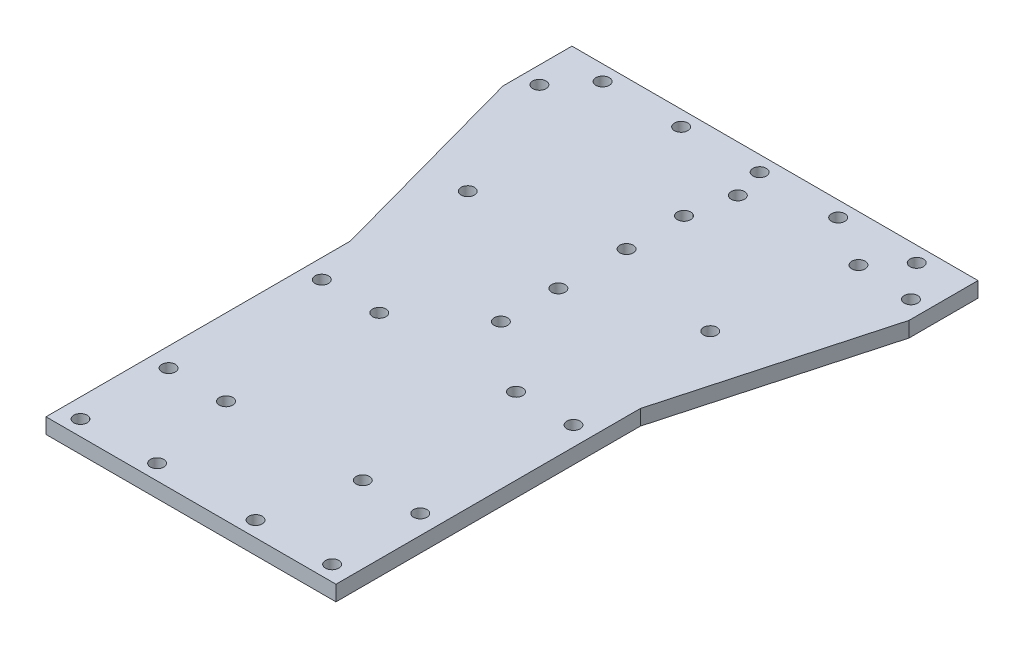
ISO-10303-21;
HEADER;
FILE_DESCRIPTION(('STEP AP214'),'2;1');
FILE_NAME('part.step','',(''),(''),'','','');
FILE_SCHEMA(('AUTOMOTIVE_DESIGN { 1 0 10303 214 1 1 1 1 }'));
ENDSEC;
DATA;
#1=APPLICATION_CONTEXT('core data for automotive mechanical design processes');
#2=APPLICATION_PROTOCOL_DEFINITION('international standard','automotive_design',2000,#1);
#3=PRODUCT_CONTEXT('',#1,'mechanical');
#4=PRODUCT('Part','Part','',(#3));
#5=PRODUCT_RELATED_PRODUCT_CATEGORY('part','',(#4));
#6=PRODUCT_DEFINITION_FORMATION('','',#4);
#7=PRODUCT_DEFINITION_CONTEXT('part definition',#1,'design');
#8=PRODUCT_DEFINITION('design','',#6,#7);
#9=PRODUCT_DEFINITION_SHAPE('','',#8);
#10=(LENGTH_UNIT() NAMED_UNIT(*) SI_UNIT(.MILLI.,.METRE.));
#11=(NAMED_UNIT(*) PLANE_ANGLE_UNIT() SI_UNIT($,.RADIAN.));
#12=(NAMED_UNIT(*) SI_UNIT($,.STERADIAN.) SOLID_ANGLE_UNIT());
#13=UNCERTAINTY_MEASURE_WITH_UNIT(LENGTH_MEASURE(1.E-05),#10,'distance_accuracy_value','');
#14=(GEOMETRIC_REPRESENTATION_CONTEXT(3) GLOBAL_UNCERTAINTY_ASSIGNED_CONTEXT((#13)) GLOBAL_UNIT_ASSIGNED_CONTEXT((#10,
#11,#12)) REPRESENTATION_CONTEXT('',''));
#15=CARTESIAN_POINT('',(0.,0.,0.));
#16=DIRECTION('',(0.,0.,1.));
#17=DIRECTION('',(1.,0.,0.));
#18=AXIS2_PLACEMENT_3D('',#15,#16,#17);
#19=CARTESIAN_POINT('',(37.85,4.,-21.35));
#20=DIRECTION('',(-1.,0.,0.));
#21=DIRECTION('',(0.,0.,1.));
#22=AXIS2_PLACEMENT_3D('',#19,#20,#21);
#23=PLANE('',#22);
#24=DIRECTION('',(0.,0.,-1.));
#25=VECTOR('',#24,1.);
#26=CARTESIAN_POINT('',(37.85,0.,-21.35));
#27=LINE('',#26,#25);
#28=CARTESIAN_POINT('',(37.85,0.,123.1));
#29=VERTEX_POINT('',#28);
#30=CARTESIAN_POINT('',(37.85,0.,43.65));
#31=VERTEX_POINT('',#30);
#32=EDGE_CURVE('E126',#29,#31,#27,.T.);
#33=ORIENTED_EDGE('',*,*,#32,.T.);
#34=DIRECTION('',(0.,1.,0.));
#35=VECTOR('',#34,1.);
#36=CARTESIAN_POINT('',(37.85,0.,43.65));
#37=LINE('',#36,#35);
#38=CARTESIAN_POINT('',(37.85,4.,43.65));
#39=VERTEX_POINT('',#38);
#40=EDGE_CURVE('E110',#31,#39,#37,.T.);
#41=ORIENTED_EDGE('',*,*,#40,.T.);
#42=DIRECTION('',(0.,0.,-1.));
#43=VECTOR('',#42,1.);
#44=CARTESIAN_POINT('',(37.85,4.,-21.35));
#45=LINE('',#44,#43);
#46=CARTESIAN_POINT('',(37.85,4.,123.1));
#47=VERTEX_POINT('',#46);
#48=EDGE_CURVE('E55',#47,#39,#45,.T.);
#49=ORIENTED_EDGE('',*,*,#48,.F.);
#50=DIRECTION('',(0.,-1.,0.));
#51=VECTOR('',#50,1.);
#52=CARTESIAN_POINT('',(37.85,4.,123.1));
#53=LINE('',#52,#51);
#54=EDGE_CURVE('E361',#47,#29,#53,.T.);
#55=ORIENTED_EDGE('',*,*,#54,.T.);
#56=EDGE_LOOP('',(#33,#41,#49,#55));
#57=FACE_BOUND('',#56,.T.);
#58=ADVANCED_FACE('F45',(#57),#23,.F.);
#59=CARTESIAN_POINT('',(-37.85,4.,-21.35));
#60=DIRECTION('',(1.,0.,0.));
#61=DIRECTION('',(0.,0.,-1.));
#62=AXIS2_PLACEMENT_3D('',#59,#60,#61);
#63=PLANE('',#62);
#64=DIRECTION('',(0.,0.,1.));
#65=VECTOR('',#64,1.);
#66=CARTESIAN_POINT('',(-37.85,4.,-21.35));
#67=LINE('',#66,#65);
#68=CARTESIAN_POINT('',(-37.85,4.,43.65));
#69=VERTEX_POINT('',#68);
#70=CARTESIAN_POINT('',(-37.85,4.,123.1));
#71=VERTEX_POINT('',#70);
#72=EDGE_CURVE('E11',#69,#71,#67,.T.);
#73=ORIENTED_EDGE('',*,*,#72,.F.);
#74=DIRECTION('',(0.,1.,0.));
#75=VECTOR('',#74,1.);
#76=CARTESIAN_POINT('',(-37.85,0.,43.65));
#77=LINE('',#76,#75);
#78=CARTESIAN_POINT('',(-37.85,0.,43.65));
#79=VERTEX_POINT('',#78);
#80=EDGE_CURVE('E392',#79,#69,#77,.T.);
#81=ORIENTED_EDGE('',*,*,#80,.F.);
#82=DIRECTION('',(0.,0.,1.));
#83=VECTOR('',#82,1.);
#84=CARTESIAN_POINT('',(-37.85,0.,-21.35));
#85=LINE('',#84,#83);
#86=CARTESIAN_POINT('',(-37.85,0.,123.1));
#87=VERTEX_POINT('',#86);
#88=EDGE_CURVE('E48',#79,#87,#85,.T.);
#89=ORIENTED_EDGE('',*,*,#88,.T.);
#90=DIRECTION('',(0.,-1.,0.));
#91=VECTOR('',#90,1.);
#92=CARTESIAN_POINT('',(-37.85,4.,123.1));
#93=LINE('',#92,#91);
#94=EDGE_CURVE('E357',#71,#87,#93,.T.);
#95=ORIENTED_EDGE('',*,*,#94,.F.);
#96=EDGE_LOOP('',(#73,#81,#89,#95));
#97=FACE_BOUND('',#96,.T.);
#98=ADVANCED_FACE('F433',(#97),#63,.F.);
#99=CARTESIAN_POINT('',(0.,4.,0.));
#100=DIRECTION('',(0.,1.,0.));
#101=DIRECTION('',(0.,0.,1.));
#102=AXIS2_PLACEMENT_3D('',#99,#100,#101);
#103=PLANE('',#102);
#104=ORIENTED_EDGE('',*,*,#48,.T.);
#105=DIRECTION('',(0.265563872912816,0.,-0.964093268000324));
#106=VECTOR('',#105,1.);
#107=CARTESIAN_POINT('',(53.,4.,-11.35));
#108=LINE('',#107,#106);
#109=CARTESIAN_POINT('',(53.,4.,-11.35));
#110=VERTEX_POINT('',#109);
#111=EDGE_CURVE('E107',#39,#110,#108,.T.);
#112=ORIENTED_EDGE('',*,*,#111,.T.);
#113=DIRECTION('',(0.,0.,1.));
#114=VECTOR('',#113,1.);
#115=CARTESIAN_POINT('',(53.,4.,0.));
#116=LINE('',#115,#114);
#117=CARTESIAN_POINT('',(53.,4.,-29.35));
#118=VERTEX_POINT('',#117);
#119=EDGE_CURVE('E290',#118,#110,#116,.T.);
#120=ORIENTED_EDGE('',*,*,#119,.F.);
#121=DIRECTION('',(-1.,0.,0.));
#122=VECTOR('',#121,1.);
#123=CARTESIAN_POINT('',(-44.,4.,-29.35));
#124=LINE('',#123,#122);
#125=CARTESIAN_POINT('',(-53.,4.,-29.35));
#126=VERTEX_POINT('',#125);
#127=EDGE_CURVE('E269',#118,#126,#124,.T.);
#128=ORIENTED_EDGE('',*,*,#127,.T.);
#129=DIRECTION('',(0.,0.,1.));
#130=VECTOR('',#129,1.);
#131=CARTESIAN_POINT('',(-53.,4.,0.));
#132=LINE('',#131,#130);
#133=CARTESIAN_POINT('',(-53.,4.,-11.35));
#134=VERTEX_POINT('',#133);
#135=EDGE_CURVE('E278',#126,#134,#132,.T.);
#136=ORIENTED_EDGE('',*,*,#135,.T.);
#137=DIRECTION('',(0.265563872912817,0.,0.964093268000324));
#138=VECTOR('',#137,1.);
#139=CARTESIAN_POINT('',(-53.,4.,-11.35));
#140=LINE('',#139,#138);
#141=EDGE_CURVE('E119',#134,#69,#140,.T.);
#142=ORIENTED_EDGE('',*,*,#141,.T.);
#143=ORIENTED_EDGE('',*,*,#72,.T.);
#144=DIRECTION('',(1.,0.,0.));
#145=VECTOR('',#144,1.);
#146=CARTESIAN_POINT('',(-37.85,4.,123.1));
#147=LINE('',#146,#145);
#148=EDGE_CURVE('E132',#71,#47,#147,.T.);
#149=ORIENTED_EDGE('',*,*,#148,.T.);
#150=EDGE_LOOP('',(#104,#112,#120,#128,#136,#142,#143,#149));
#151=FACE_BOUND('',#150,.T.);
#152=CARTESIAN_POINT('',(12.85,4.,119.1));
#153=DIRECTION('',(0.,-1.,0.));
#154=DIRECTION('',(0.,0.,1.));
#155=AXIS2_PLACEMENT_3D('',#152,#153,#154);
#156=CIRCLE('',#155,1.75);
#157=CARTESIAN_POINT('',(12.85,4.,120.85));
#158=VERTEX_POINT('',#157);
#159=EDGE_CURVE('E396',#158,#158,#156,.T.);
#160=ORIENTED_EDGE('',*,*,#159,.T.);
#161=EDGE_LOOP('',(#160));
#162=FACE_BOUND('',#161,.T.);
#163=CARTESIAN_POINT('',(32.85,4.,119.1));
#164=DIRECTION('',(0.,-1.,0.));
#165=DIRECTION('',(0.,0.,1.));
#166=AXIS2_PLACEMENT_3D('',#163,#164,#165);
#167=CIRCLE('',#166,1.75);
#168=CARTESIAN_POINT('',(32.85,4.,120.85));
#169=VERTEX_POINT('',#168);
#170=EDGE_CURVE('E387',#169,#169,#167,.T.);
#171=ORIENTED_EDGE('',*,*,#170,.T.);
#172=EDGE_LOOP('',(#171));
#173=FACE_BOUND('',#172,.T.);
#174=CARTESIAN_POINT('',(-12.85,4.,119.1));
#175=DIRECTION('',(0.,1.,0.));
#176=DIRECTION('',(0.,0.,1.));
#177=AXIS2_PLACEMENT_3D('',#174,#175,#176);
#178=CIRCLE('',#177,1.75);
#179=CARTESIAN_POINT('',(-12.85,4.,120.85));
#180=VERTEX_POINT('',#179);
#181=EDGE_CURVE('E380',#180,#180,#178,.T.);
#182=ORIENTED_EDGE('',*,*,#181,.F.);
#183=EDGE_LOOP('',(#182));
#184=FACE_BOUND('',#183,.T.);
#185=CARTESIAN_POINT('',(-32.85,4.,119.1));
#186=DIRECTION('',(0.,1.,0.));
#187=DIRECTION('',(0.,0.,1.));
#188=AXIS2_PLACEMENT_3D('',#185,#186,#187);
#189=CIRCLE('',#188,1.75);
#190=CARTESIAN_POINT('',(-32.85,4.,120.85));
#191=VERTEX_POINT('',#190);
#192=EDGE_CURVE('E375',#191,#191,#189,.T.);
#193=ORIENTED_EDGE('',*,*,#192,.F.);
#194=EDGE_LOOP('',(#193));
#195=FACE_BOUND('',#194,.T.);
#196=CARTESIAN_POINT('',(-41.,4.,-25.35));
#197=DIRECTION('',(0.,1.,0.));
#198=DIRECTION('',(0.,0.,1.));
#199=AXIS2_PLACEMENT_3D('',#196,#197,#198);
#200=CIRCLE('',#199,1.75);
#201=CARTESIAN_POINT('',(-41.,4.,-23.6));
#202=VERTEX_POINT('',#201);
#203=EDGE_CURVE('E314',#202,#202,#200,.T.);
#204=ORIENTED_EDGE('',*,*,#203,.F.);
#205=EDGE_LOOP('',(#204));
#206=FACE_BOUND('',#205,.T.);
#207=CARTESIAN_POINT('',(0.,4.,-25.35));
#208=DIRECTION('',(0.,1.,0.));
#209=DIRECTION('',(0.,0.,1.));
#210=AXIS2_PLACEMENT_3D('',#207,#208,#209);
#211=CIRCLE('',#210,1.75);
#212=CARTESIAN_POINT('',(0.,4.,-23.6));
#213=VERTEX_POINT('',#212);
#214=EDGE_CURVE('E319',#213,#213,#211,.T.);
#215=ORIENTED_EDGE('',*,*,#214,.F.);
#216=EDGE_LOOP('',(#215));
#217=FACE_BOUND('',#216,.T.);
#218=CARTESIAN_POINT('',(41.,4.,-25.35));
#219=DIRECTION('',(0.,1.,0.));
#220=DIRECTION('',(0.,0.,1.));
#221=AXIS2_PLACEMENT_3D('',#218,#219,#220);
#222=CIRCLE('',#221,1.75);
#223=CARTESIAN_POINT('',(41.,4.,-23.6));
#224=VERTEX_POINT('',#223);
#225=EDGE_CURVE('E302',#224,#224,#222,.T.);
#226=ORIENTED_EDGE('',*,*,#225,.F.);
#227=EDGE_LOOP('',(#226));
#228=FACE_BOUND('',#227,.T.);
#229=CARTESIAN_POINT('',(20.5,4.,-25.35));
#230=DIRECTION('',(0.,1.,0.));
#231=DIRECTION('',(0.,0.,1.));
#232=AXIS2_PLACEMENT_3D('',#229,#230,#231);
#233=CIRCLE('',#232,1.75);
#234=CARTESIAN_POINT('',(20.5,4.,-23.6));
#235=VERTEX_POINT('',#234);
#236=EDGE_CURVE('E301',#235,#235,#233,.T.);
#237=ORIENTED_EDGE('',*,*,#236,.F.);
#238=EDGE_LOOP('',(#237));
#239=FACE_BOUND('',#238,.T.);
#240=CARTESIAN_POINT('',(-20.5,4.,-25.35));
#241=DIRECTION('',(0.,1.,0.));
#242=DIRECTION('',(0.,0.,1.));
#243=AXIS2_PLACEMENT_3D('',#240,#241,#242);
#244=CIRCLE('',#243,1.75);
#245=CARTESIAN_POINT('',(-20.5,4.,-23.6));
#246=VERTEX_POINT('',#245);
#247=EDGE_CURVE('E310',#246,#246,#244,.T.);
#248=ORIENTED_EDGE('',*,*,#247,.F.);
#249=EDGE_LOOP('',(#248));
#250=FACE_BOUND('',#249,.T.);
#251=CARTESIAN_POINT('',(0.,4.,-5.6));
#252=DIRECTION('',(0.,1.,0.));
#253=DIRECTION('',(0.,0.,1.));
#254=AXIS2_PLACEMENT_3D('',#251,#252,#253);
#255=CIRCLE('',#254,1.75);
#256=CARTESIAN_POINT('',(0.,4.,-3.85));
#257=VERTEX_POINT('',#256);
#258=EDGE_CURVE('E199',#257,#257,#255,.T.);
#259=ORIENTED_EDGE('',*,*,#258,.F.);
#260=EDGE_LOOP('',(#259));
#261=FACE_BOUND('',#260,.T.);
#262=CARTESIAN_POINT('',(0.,4.,9.4));
#263=DIRECTION('',(0.,1.,0.));
#264=DIRECTION('',(0.,0.,1.));
#265=AXIS2_PLACEMENT_3D('',#262,#263,#264);
#266=CIRCLE('',#265,1.75);
#267=CARTESIAN_POINT('',(0.,4.,11.15));
#268=VERTEX_POINT('',#267);
#269=EDGE_CURVE('E194',#268,#268,#266,.T.);
#270=ORIENTED_EDGE('',*,*,#269,.F.);
#271=EDGE_LOOP('',(#270));
#272=FACE_BOUND('',#271,.T.);
#273=CARTESIAN_POINT('',(29.5,4.,17.05));
#274=DIRECTION('',(0.,1.,0.));
#275=DIRECTION('',(0.,0.,1.));
#276=AXIS2_PLACEMENT_3D('',#273,#274,#275);
#277=CIRCLE('',#276,1.75);
#278=CARTESIAN_POINT('',(29.5,4.,18.8));
#279=VERTEX_POINT('',#278);
#280=EDGE_CURVE('E154',#279,#279,#277,.T.);
#281=ORIENTED_EDGE('',*,*,#280,.F.);
#282=EDGE_LOOP('',(#281));
#283=FACE_BOUND('',#282,.T.);
#284=CARTESIAN_POINT('',(2.39999999999999,4.,-17.25));
#285=DIRECTION('',(0.,1.,0.));
#286=DIRECTION('',(0.,0.,1.));
#287=AXIS2_PLACEMENT_3D('',#284,#285,#286);
#288=CIRCLE('',#287,1.75);
#289=CARTESIAN_POINT('',(2.39999999999999,4.,-15.5));
#290=VERTEX_POINT('',#289);
#291=EDGE_CURVE('E141',#290,#290,#288,.T.);
#292=ORIENTED_EDGE('',*,*,#291,.F.);
#293=EDGE_LOOP('',(#292));
#294=FACE_BOUND('',#293,.T.);
#295=CARTESIAN_POINT('',(-33.8,4.,17.05));
#296=DIRECTION('',(0.,1.,0.));
#297=DIRECTION('',(0.,0.,1.));
#298=AXIS2_PLACEMENT_3D('',#295,#296,#297);
#299=CIRCLE('',#298,1.75);
#300=CARTESIAN_POINT('',(-33.8,4.,18.8));
#301=VERTEX_POINT('',#300);
#302=EDGE_CURVE('E148',#301,#301,#299,.T.);
#303=ORIENTED_EDGE('',*,*,#302,.F.);
#304=EDGE_LOOP('',(#303));
#305=FACE_BOUND('',#304,.T.);
#306=CARTESIAN_POINT('',(33.9,4.,-17.25));
#307=DIRECTION('',(0.,1.,0.));
#308=DIRECTION('',(0.,0.,1.));
#309=AXIS2_PLACEMENT_3D('',#306,#307,#308);
#310=CIRCLE('',#309,1.75);
#311=CARTESIAN_POINT('',(33.9,4.,-15.5));
#312=VERTEX_POINT('',#311);
#313=EDGE_CURVE('E162',#312,#312,#310,.T.);
#314=ORIENTED_EDGE('',*,*,#313,.F.);
#315=EDGE_LOOP('',(#314));
#316=FACE_BOUND('',#315,.T.);
#317=CARTESIAN_POINT('',(0.,4.,42.2));
#318=DIRECTION('',(0.,1.,0.));
#319=DIRECTION('',(0.,0.,1.));
#320=AXIS2_PLACEMENT_3D('',#317,#318,#319);
#321=CIRCLE('',#320,1.75);
#322=CARTESIAN_POINT('',(0.,4.,43.95));
#323=VERTEX_POINT('',#322);
#324=EDGE_CURVE('E179',#323,#323,#321,.T.);
#325=ORIENTED_EDGE('',*,*,#324,.F.);
#326=EDGE_LOOP('',(#325));
#327=FACE_BOUND('',#326,.T.);
#328=CARTESIAN_POINT('',(0.,4.,27.2));
#329=DIRECTION('',(0.,1.,0.));
#330=DIRECTION('',(0.,0.,1.));
#331=AXIS2_PLACEMENT_3D('',#328,#329,#330);
#332=CIRCLE('',#331,1.75);
#333=CARTESIAN_POINT('',(0.,4.,28.95));
#334=VERTEX_POINT('',#333);
#335=EDGE_CURVE('E174',#334,#334,#332,.T.);
#336=ORIENTED_EDGE('',*,*,#335,.F.);
#337=EDGE_LOOP('',(#336));
#338=FACE_BOUND('',#337,.T.);
#339=CARTESIAN_POINT('',(17.85,4.,56.1));
#340=DIRECTION('',(0.,1.,0.));
#341=DIRECTION('',(0.,0.,-1.));
#342=AXIS2_PLACEMENT_3D('',#339,#340,#341);
#343=CIRCLE('',#342,1.75);
#344=CARTESIAN_POINT('',(17.85,4.,54.35));
#345=VERTEX_POINT('',#344);
#346=EDGE_CURVE('E250',#345,#345,#343,.T.);
#347=ORIENTED_EDGE('',*,*,#346,.F.);
#348=EDGE_LOOP('',(#347));
#349=FACE_BOUND('',#348,.T.);
#350=CARTESIAN_POINT('',(32.85,4.,96.1));
#351=DIRECTION('',(0.,1.,0.));
#352=DIRECTION('',(0.,0.,-1.));
#353=AXIS2_PLACEMENT_3D('',#350,#351,#352);
#354=CIRCLE('',#353,1.75);
#355=CARTESIAN_POINT('',(32.85,4.,94.35));
#356=VERTEX_POINT('',#355);
#357=EDGE_CURVE('E234',#356,#356,#354,.T.);
#358=ORIENTED_EDGE('',*,*,#357,.F.);
#359=EDGE_LOOP('',(#358));
#360=FACE_BOUND('',#359,.T.);
#361=CARTESIAN_POINT('',(-17.85,4.,96.1));
#362=DIRECTION('',(0.,1.,0.));
#363=DIRECTION('',(0.,0.,1.));
#364=AXIS2_PLACEMENT_3D('',#361,#362,#363);
#365=CIRCLE('',#364,1.75);
#366=CARTESIAN_POINT('',(-17.85,4.,97.85));
#367=VERTEX_POINT('',#366);
#368=EDGE_CURVE('E218',#367,#367,#365,.T.);
#369=ORIENTED_EDGE('',*,*,#368,.F.);
#370=EDGE_LOOP('',(#369));
#371=FACE_BOUND('',#370,.T.);
#372=CARTESIAN_POINT('',(-32.85,4.,56.1));
#373=DIRECTION('',(0.,1.,0.));
#374=DIRECTION('',(0.,0.,1.));
#375=AXIS2_PLACEMENT_3D('',#372,#373,#374);
#376=CIRCLE('',#375,1.75);
#377=CARTESIAN_POINT('',(-32.85,4.,57.85));
#378=VERTEX_POINT('',#377);
#379=EDGE_CURVE('E195',#378,#378,#376,.T.);
#380=ORIENTED_EDGE('',*,*,#379,.F.);
#381=EDGE_LOOP('',(#380));
#382=FACE_BOUND('',#381,.T.);
#383=CARTESIAN_POINT('',(-17.85,4.,56.1));
#384=DIRECTION('',(0.,1.,0.));
#385=DIRECTION('',(0.,0.,1.));
#386=AXIS2_PLACEMENT_3D('',#383,#384,#385);
#387=CIRCLE('',#386,1.75);
#388=CARTESIAN_POINT('',(-17.85,4.,57.85));
#389=VERTEX_POINT('',#388);
#390=EDGE_CURVE('E210',#389,#389,#387,.T.);
#391=ORIENTED_EDGE('',*,*,#390,.F.);
#392=EDGE_LOOP('',(#391));
#393=FACE_BOUND('',#392,.T.);
#394=CARTESIAN_POINT('',(-32.85,4.,96.1));
#395=DIRECTION('',(0.,1.,0.));
#396=DIRECTION('',(0.,0.,1.));
#397=AXIS2_PLACEMENT_3D('',#394,#395,#396);
#398=CIRCLE('',#397,1.75);
#399=CARTESIAN_POINT('',(-32.85,4.,97.85));
#400=VERTEX_POINT('',#399);
#401=EDGE_CURVE('E226',#400,#400,#398,.T.);
#402=ORIENTED_EDGE('',*,*,#401,.F.);
#403=EDGE_LOOP('',(#402));
#404=FACE_BOUND('',#403,.T.);
#405=CARTESIAN_POINT('',(17.85,4.,96.1));
#406=DIRECTION('',(0.,1.,0.));
#407=DIRECTION('',(0.,0.,-1.));
#408=AXIS2_PLACEMENT_3D('',#405,#406,#407);
#409=CIRCLE('',#408,1.75);
#410=CARTESIAN_POINT('',(17.85,4.,94.35));
#411=VERTEX_POINT('',#410);
#412=EDGE_CURVE('E242',#411,#411,#409,.T.);
#413=ORIENTED_EDGE('',*,*,#412,.F.);
#414=EDGE_LOOP('',(#413));
#415=FACE_BOUND('',#414,.T.);
#416=CARTESIAN_POINT('',(32.85,4.,56.1));
#417=DIRECTION('',(0.,1.,0.));
#418=DIRECTION('',(0.,0.,-1.));
#419=AXIS2_PLACEMENT_3D('',#416,#417,#418);
#420=CIRCLE('',#419,1.75);
#421=CARTESIAN_POINT('',(32.85,4.,54.35));
#422=VERTEX_POINT('',#421);
#423=EDGE_CURVE('E258',#422,#422,#420,.T.);
#424=ORIENTED_EDGE('',*,*,#423,.F.);
#425=EDGE_LOOP('',(#424));
#426=FACE_BOUND('',#425,.T.);
#427=CARTESIAN_POINT('',(-48.5,4.,-16.35));
#428=DIRECTION('',(0.,1.,0.));
#429=DIRECTION('',(0.,0.,1.));
#430=AXIS2_PLACEMENT_3D('',#427,#428,#429);
#431=CIRCLE('',#430,1.75);
#432=CARTESIAN_POINT('',(-48.5,4.,-14.6));
#433=VERTEX_POINT('',#432);
#434=EDGE_CURVE('E339',#433,#433,#431,.T.);
#435=ORIENTED_EDGE('',*,*,#434,.F.);
#436=EDGE_LOOP('',(#435));
#437=FACE_BOUND('',#436,.T.);
#438=CARTESIAN_POINT('',(48.5,4.,-16.35));
#439=DIRECTION('',(0.,1.,0.));
#440=DIRECTION('',(0.,0.,1.));
#441=AXIS2_PLACEMENT_3D('',#438,#439,#440);
#442=CIRCLE('',#441,1.75);
#443=CARTESIAN_POINT('',(48.5,4.,-14.6));
#444=VERTEX_POINT('',#443);
#445=EDGE_CURVE('E348',#444,#444,#442,.T.);
#446=ORIENTED_EDGE('',*,*,#445,.F.);
#447=EDGE_LOOP('',(#446));
#448=FACE_BOUND('',#447,.T.);
#449=ADVANCED_FACE('F129',(#151,#162,#173,#184,#195,#206,#217,#228,#239,#250,#261,#272,#283,
#294,#305,#316,#327,#338,#349,#360,#371,#382,#393,#404,#415,#426,#437,#448),#103,.T.);
#450=CARTESIAN_POINT('',(0.,0.,0.));
#451=DIRECTION('',(0.,1.,0.));
#452=DIRECTION('',(0.,0.,1.));
#453=AXIS2_PLACEMENT_3D('',#450,#451,#452);
#454=PLANE('',#453);
#455=DIRECTION('',(0.265563872912816,0.,-0.964093268000324));
#456=VECTOR('',#455,1.);
#457=CARTESIAN_POINT('',(53.,0.,-11.35));
#458=LINE('',#457,#456);
#459=CARTESIAN_POINT('',(53.,0.,-11.35));
#460=VERTEX_POINT('',#459);
#461=EDGE_CURVE('E120',#31,#460,#458,.T.);
#462=ORIENTED_EDGE('',*,*,#461,.F.);
#463=ORIENTED_EDGE('',*,*,#32,.F.);
#464=DIRECTION('',(1.,0.,0.));
#465=VECTOR('',#464,1.);
#466=CARTESIAN_POINT('',(-37.85,0.,123.1));
#467=LINE('',#466,#465);
#468=EDGE_CURVE('E364',#87,#29,#467,.T.);
#469=ORIENTED_EDGE('',*,*,#468,.F.);
#470=ORIENTED_EDGE('',*,*,#88,.F.);
#471=DIRECTION('',(0.265563872912817,0.,0.964093268000324));
#472=VECTOR('',#471,1.);
#473=CARTESIAN_POINT('',(-53.,0.,-11.35));
#474=LINE('',#473,#472);
#475=CARTESIAN_POINT('',(-53.,0.,-11.35));
#476=VERTEX_POINT('',#475);
#477=EDGE_CURVE('E405',#476,#79,#474,.T.);
#478=ORIENTED_EDGE('',*,*,#477,.F.);
#479=DIRECTION('',(0.,0.,1.));
#480=VECTOR('',#479,1.);
#481=CARTESIAN_POINT('',(-53.,0.,0.));
#482=LINE('',#481,#480);
#483=CARTESIAN_POINT('',(-53.,0.,-29.35));
#484=VERTEX_POINT('',#483);
#485=EDGE_CURVE('E277',#484,#476,#482,.T.);
#486=ORIENTED_EDGE('',*,*,#485,.F.);
#487=DIRECTION('',(-1.,0.,0.));
#488=VECTOR('',#487,1.);
#489=CARTESIAN_POINT('',(-44.,0.,-29.35));
#490=LINE('',#489,#488);
#491=CARTESIAN_POINT('',(53.,0.,-29.35));
#492=VERTEX_POINT('',#491);
#493=EDGE_CURVE('E62',#492,#484,#490,.T.);
#494=ORIENTED_EDGE('',*,*,#493,.F.);
#495=DIRECTION('',(0.,0.,1.));
#496=VECTOR('',#495,1.);
#497=CARTESIAN_POINT('',(53.,0.,0.));
#498=LINE('',#497,#496);
#499=EDGE_CURVE('E289',#492,#460,#498,.T.);
#500=ORIENTED_EDGE('',*,*,#499,.T.);
#501=EDGE_LOOP('',(#462,#463,#469,#470,#478,#486,#494,#500));
#502=FACE_BOUND('',#501,.T.);
#503=CARTESIAN_POINT('',(12.85,0.,119.1));
#504=DIRECTION('',(0.,-1.,0.));
#505=DIRECTION('',(0.,0.,1.));
#506=AXIS2_PLACEMENT_3D('',#503,#504,#505);
#507=CIRCLE('',#506,1.75);
#508=CARTESIAN_POINT('',(12.85,0.,120.85));
#509=VERTEX_POINT('',#508);
#510=EDGE_CURVE('E376',#509,#509,#507,.T.);
#511=ORIENTED_EDGE('',*,*,#510,.F.);
#512=EDGE_LOOP('',(#511));
#513=FACE_BOUND('',#512,.T.);
#514=CARTESIAN_POINT('',(32.85,0.,119.1));
#515=DIRECTION('',(0.,-1.,0.));
#516=DIRECTION('',(0.,0.,1.));
#517=AXIS2_PLACEMENT_3D('',#514,#515,#516);
#518=CIRCLE('',#517,1.75);
#519=CARTESIAN_POINT('',(32.85,0.,120.85));
#520=VERTEX_POINT('',#519);
#521=EDGE_CURVE('E391',#520,#520,#518,.T.);
#522=ORIENTED_EDGE('',*,*,#521,.F.);
#523=EDGE_LOOP('',(#522));
#524=FACE_BOUND('',#523,.T.);
#525=CARTESIAN_POINT('',(-12.85,0.,119.1));
#526=DIRECTION('',(0.,1.,0.));
#527=DIRECTION('',(0.,0.,1.));
#528=AXIS2_PLACEMENT_3D('',#525,#526,#527);
#529=CIRCLE('',#528,1.75);
#530=CARTESIAN_POINT('',(-12.85,0.,120.85));
#531=VERTEX_POINT('',#530);
#532=EDGE_CURVE('E368',#531,#531,#529,.T.);
#533=ORIENTED_EDGE('',*,*,#532,.T.);
#534=EDGE_LOOP('',(#533));
#535=FACE_BOUND('',#534,.T.);
#536=CARTESIAN_POINT('',(-32.85,0.,119.1));
#537=DIRECTION('',(0.,1.,0.));
#538=DIRECTION('',(0.,0.,1.));
#539=AXIS2_PLACEMENT_3D('',#536,#537,#538);
#540=CIRCLE('',#539,1.75);
#541=CARTESIAN_POINT('',(-32.85,0.,120.85));
#542=VERTEX_POINT('',#541);
#543=EDGE_CURVE('E371',#542,#542,#540,.T.);
#544=ORIENTED_EDGE('',*,*,#543,.T.);
#545=EDGE_LOOP('',(#544));
#546=FACE_BOUND('',#545,.T.);
#547=CARTESIAN_POINT('',(-41.,0.,-25.35));
#548=DIRECTION('',(0.,1.,0.));
#549=DIRECTION('',(0.,0.,1.));
#550=AXIS2_PLACEMENT_3D('',#547,#548,#549);
#551=CIRCLE('',#550,1.75);
#552=CARTESIAN_POINT('',(-41.,0.,-23.6));
#553=VERTEX_POINT('',#552);
#554=EDGE_CURVE('E293',#553,#553,#551,.T.);
#555=ORIENTED_EDGE('',*,*,#554,.T.);
#556=EDGE_LOOP('',(#555));
#557=FACE_BOUND('',#556,.T.);
#558=CARTESIAN_POINT('',(0.,0.,-25.35));
#559=DIRECTION('',(0.,1.,0.));
#560=DIRECTION('',(0.,0.,1.));
#561=AXIS2_PLACEMENT_3D('',#558,#559,#560);
#562=CIRCLE('',#561,1.75);
#563=CARTESIAN_POINT('',(0.,0.,-23.6));
#564=VERTEX_POINT('',#563);
#565=EDGE_CURVE('E315',#564,#564,#562,.T.);
#566=ORIENTED_EDGE('',*,*,#565,.T.);
#567=EDGE_LOOP('',(#566));
#568=FACE_BOUND('',#567,.T.);
#569=CARTESIAN_POINT('',(41.,0.,-25.35));
#570=DIRECTION('',(0.,1.,0.));
#571=DIRECTION('',(0.,0.,1.));
#572=AXIS2_PLACEMENT_3D('',#569,#570,#571);
#573=CIRCLE('',#572,1.75);
#574=CARTESIAN_POINT('',(41.,0.,-23.6));
#575=VERTEX_POINT('',#574);
#576=EDGE_CURVE('E324',#575,#575,#573,.T.);
#577=ORIENTED_EDGE('',*,*,#576,.T.);
#578=EDGE_LOOP('',(#577));
#579=FACE_BOUND('',#578,.T.);
#580=CARTESIAN_POINT('',(20.5,0.,-25.35));
#581=DIRECTION('',(0.,1.,0.));
#582=DIRECTION('',(0.,0.,1.));
#583=AXIS2_PLACEMENT_3D('',#580,#581,#582);
#584=CIRCLE('',#583,1.75);
#585=CARTESIAN_POINT('',(20.5,0.,-23.6));
#586=VERTEX_POINT('',#585);
#587=EDGE_CURVE('E297',#586,#586,#584,.T.);
#588=ORIENTED_EDGE('',*,*,#587,.T.);
#589=EDGE_LOOP('',(#588));
#590=FACE_BOUND('',#589,.T.);
#591=CARTESIAN_POINT('',(-20.5,0.,-25.35));
#592=DIRECTION('',(0.,1.,0.));
#593=DIRECTION('',(0.,0.,1.));
#594=AXIS2_PLACEMENT_3D('',#591,#592,#593);
#595=CIRCLE('',#594,1.75);
#596=CARTESIAN_POINT('',(-20.5,0.,-23.6));
#597=VERTEX_POINT('',#596);
#598=EDGE_CURVE('E306',#597,#597,#595,.T.);
#599=ORIENTED_EDGE('',*,*,#598,.T.);
#600=EDGE_LOOP('',(#599));
#601=FACE_BOUND('',#600,.T.);
#602=CARTESIAN_POINT('',(0.,0.,-5.6));
#603=DIRECTION('',(0.,1.,0.));
#604=DIRECTION('',(0.,0.,1.));
#605=AXIS2_PLACEMENT_3D('',#602,#603,#604);
#606=CIRCLE('',#605,1.75);
#607=CARTESIAN_POINT('',(0.,0.,-3.85));
#608=VERTEX_POINT('',#607);
#609=EDGE_CURVE('E183',#608,#608,#606,.T.);
#610=ORIENTED_EDGE('',*,*,#609,.T.);
#611=EDGE_LOOP('',(#610));
#612=FACE_BOUND('',#611,.T.);
#613=CARTESIAN_POINT('',(0.,0.,9.4));
#614=DIRECTION('',(0.,1.,0.));
#615=DIRECTION('',(0.,0.,1.));
#616=AXIS2_PLACEMENT_3D('',#613,#614,#615);
#617=CIRCLE('',#616,1.75);
#618=CARTESIAN_POINT('',(0.,0.,11.15));
#619=VERTEX_POINT('',#618);
#620=EDGE_CURVE('E190',#619,#619,#617,.T.);
#621=ORIENTED_EDGE('',*,*,#620,.T.);
#622=EDGE_LOOP('',(#621));
#623=FACE_BOUND('',#622,.T.);
#624=CARTESIAN_POINT('',(2.39999999999999,0.,-17.25));
#625=DIRECTION('',(0.,1.,0.));
#626=DIRECTION('',(0.,0.,1.));
#627=AXIS2_PLACEMENT_3D('',#624,#625,#626);
#628=CIRCLE('',#627,1.75);
#629=CARTESIAN_POINT('',(2.39999999999999,0.,-15.5));
#630=VERTEX_POINT('',#629);
#631=EDGE_CURVE('E138',#630,#630,#628,.T.);
#632=ORIENTED_EDGE('',*,*,#631,.T.);
#633=EDGE_LOOP('',(#632));
#634=FACE_BOUND('',#633,.T.);
#635=CARTESIAN_POINT('',(-33.8,0.,17.05));
#636=DIRECTION('',(0.,1.,0.));
#637=DIRECTION('',(0.,0.,1.));
#638=AXIS2_PLACEMENT_3D('',#635,#636,#637);
#639=CIRCLE('',#638,1.75);
#640=CARTESIAN_POINT('',(-33.8,0.,18.8));
#641=VERTEX_POINT('',#640);
#642=EDGE_CURVE('E150',#641,#641,#639,.T.);
#643=ORIENTED_EDGE('',*,*,#642,.T.);
#644=EDGE_LOOP('',(#643));
#645=FACE_BOUND('',#644,.T.);
#646=CARTESIAN_POINT('',(29.5,0.,17.05));
#647=DIRECTION('',(0.,1.,0.));
#648=DIRECTION('',(0.,0.,1.));
#649=AXIS2_PLACEMENT_3D('',#646,#647,#648);
#650=CIRCLE('',#649,1.75);
#651=CARTESIAN_POINT('',(29.5,0.,18.8));
#652=VERTEX_POINT('',#651);
#653=EDGE_CURVE('E158',#652,#652,#650,.T.);
#654=ORIENTED_EDGE('',*,*,#653,.T.);
#655=EDGE_LOOP('',(#654));
#656=FACE_BOUND('',#655,.T.);
#657=CARTESIAN_POINT('',(33.9,0.,-17.25));
#658=DIRECTION('',(0.,1.,0.));
#659=DIRECTION('',(0.,0.,1.));
#660=AXIS2_PLACEMENT_3D('',#657,#658,#659);
#661=CIRCLE('',#660,1.75);
#662=CARTESIAN_POINT('',(33.9,0.,-15.5));
#663=VERTEX_POINT('',#662);
#664=EDGE_CURVE('E166',#663,#663,#661,.T.);
#665=ORIENTED_EDGE('',*,*,#664,.T.);
#666=EDGE_LOOP('',(#665));
#667=FACE_BOUND('',#666,.T.);
#668=CARTESIAN_POINT('',(0.,0.,42.2));
#669=DIRECTION('',(0.,1.,0.));
#670=DIRECTION('',(0.,0.,1.));
#671=AXIS2_PLACEMENT_3D('',#668,#669,#670);
#672=CIRCLE('',#671,1.75);
#673=CARTESIAN_POINT('',(0.,0.,43.95));
#674=VERTEX_POINT('',#673);
#675=EDGE_CURVE('E178',#674,#674,#672,.T.);
#676=ORIENTED_EDGE('',*,*,#675,.T.);
#677=EDGE_LOOP('',(#676));
#678=FACE_BOUND('',#677,.T.);
#679=CARTESIAN_POINT('',(0.,0.,27.2));
#680=DIRECTION('',(0.,1.,0.));
#681=DIRECTION('',(0.,0.,1.));
#682=AXIS2_PLACEMENT_3D('',#679,#680,#681);
#683=CIRCLE('',#682,1.75);
#684=CARTESIAN_POINT('',(0.,0.,28.95));
#685=VERTEX_POINT('',#684);
#686=EDGE_CURVE('E170',#685,#685,#683,.T.);
#687=ORIENTED_EDGE('',*,*,#686,.T.);
#688=EDGE_LOOP('',(#687));
#689=FACE_BOUND('',#688,.T.);
#690=CARTESIAN_POINT('',(-32.85,0.,56.1));
#691=DIRECTION('',(0.,1.,0.));
#692=DIRECTION('',(0.,0.,1.));
#693=AXIS2_PLACEMENT_3D('',#690,#691,#692);
#694=CIRCLE('',#693,1.75);
#695=CARTESIAN_POINT('',(-32.85,0.,57.85));
#696=VERTEX_POINT('',#695);
#697=EDGE_CURVE('E206',#696,#696,#694,.T.);
#698=ORIENTED_EDGE('',*,*,#697,.T.);
#699=EDGE_LOOP('',(#698));
#700=FACE_BOUND('',#699,.T.);
#701=CARTESIAN_POINT('',(-17.85,0.,56.1));
#702=DIRECTION('',(0.,1.,0.));
#703=DIRECTION('',(0.,0.,1.));
#704=AXIS2_PLACEMENT_3D('',#701,#702,#703);
#705=CIRCLE('',#704,1.75);
#706=CARTESIAN_POINT('',(-17.85,0.,57.85));
#707=VERTEX_POINT('',#706);
#708=EDGE_CURVE('E214',#707,#707,#705,.T.);
#709=ORIENTED_EDGE('',*,*,#708,.T.);
#710=EDGE_LOOP('',(#709));
#711=FACE_BOUND('',#710,.T.);
#712=CARTESIAN_POINT('',(-17.85,0.,96.1));
#713=DIRECTION('',(0.,1.,0.));
#714=DIRECTION('',(0.,0.,1.));
#715=AXIS2_PLACEMENT_3D('',#712,#713,#714);
#716=CIRCLE('',#715,1.75);
#717=CARTESIAN_POINT('',(-17.85,0.,97.85));
#718=VERTEX_POINT('',#717);
#719=EDGE_CURVE('E222',#718,#718,#716,.T.);
#720=ORIENTED_EDGE('',*,*,#719,.T.);
#721=EDGE_LOOP('',(#720));
#722=FACE_BOUND('',#721,.T.);
#723=CARTESIAN_POINT('',(-32.85,0.,96.1));
#724=DIRECTION('',(0.,1.,0.));
#725=DIRECTION('',(0.,0.,1.));
#726=AXIS2_PLACEMENT_3D('',#723,#724,#725);
#727=CIRCLE('',#726,1.75);
#728=CARTESIAN_POINT('',(-32.85,0.,97.85));
#729=VERTEX_POINT('',#728);
#730=EDGE_CURVE('E230',#729,#729,#727,.T.);
#731=ORIENTED_EDGE('',*,*,#730,.T.);
#732=EDGE_LOOP('',(#731));
#733=FACE_BOUND('',#732,.T.);
#734=CARTESIAN_POINT('',(32.85,0.,96.1));
#735=DIRECTION('',(0.,1.,0.));
#736=DIRECTION('',(0.,0.,-1.));
#737=AXIS2_PLACEMENT_3D('',#734,#735,#736);
#738=CIRCLE('',#737,1.75);
#739=CARTESIAN_POINT('',(32.85,0.,94.35));
#740=VERTEX_POINT('',#739);
#741=EDGE_CURVE('E238',#740,#740,#738,.T.);
#742=ORIENTED_EDGE('',*,*,#741,.T.);
#743=EDGE_LOOP('',(#742));
#744=FACE_BOUND('',#743,.T.);
#745=CARTESIAN_POINT('',(17.85,0.,96.1));
#746=DIRECTION('',(0.,1.,0.));
#747=DIRECTION('',(0.,0.,-1.));
#748=AXIS2_PLACEMENT_3D('',#745,#746,#747);
#749=CIRCLE('',#748,1.75);
#750=CARTESIAN_POINT('',(17.85,0.,94.35));
#751=VERTEX_POINT('',#750);
#752=EDGE_CURVE('E246',#751,#751,#749,.T.);
#753=ORIENTED_EDGE('',*,*,#752,.T.);
#754=EDGE_LOOP('',(#753));
#755=FACE_BOUND('',#754,.T.);
#756=CARTESIAN_POINT('',(17.85,0.,56.1));
#757=DIRECTION('',(0.,1.,0.));
#758=DIRECTION('',(0.,0.,-1.));
#759=AXIS2_PLACEMENT_3D('',#756,#757,#758);
#760=CIRCLE('',#759,1.75);
#761=CARTESIAN_POINT('',(17.85,0.,54.35));
#762=VERTEX_POINT('',#761);
#763=EDGE_CURVE('E254',#762,#762,#760,.T.);
#764=ORIENTED_EDGE('',*,*,#763,.T.);
#765=EDGE_LOOP('',(#764));
#766=FACE_BOUND('',#765,.T.);
#767=CARTESIAN_POINT('',(32.85,0.,56.1));
#768=DIRECTION('',(0.,1.,0.));
#769=DIRECTION('',(0.,0.,-1.));
#770=AXIS2_PLACEMENT_3D('',#767,#768,#769);
#771=CIRCLE('',#770,1.75);
#772=CARTESIAN_POINT('',(32.85,0.,54.35));
#773=VERTEX_POINT('',#772);
#774=EDGE_CURVE('E262',#773,#773,#771,.T.);
#775=ORIENTED_EDGE('',*,*,#774,.T.);
#776=EDGE_LOOP('',(#775));
#777=FACE_BOUND('',#776,.T.);
#778=CARTESIAN_POINT('',(-48.5,0.,-16.35));
#779=DIRECTION('',(0.,1.,0.));
#780=DIRECTION('',(0.,0.,1.));
#781=AXIS2_PLACEMENT_3D('',#778,#779,#780);
#782=CIRCLE('',#781,1.75);
#783=CARTESIAN_POINT('',(-48.5,0.,-14.6));
#784=VERTEX_POINT('',#783);
#785=EDGE_CURVE('E340',#784,#784,#782,.T.);
#786=ORIENTED_EDGE('',*,*,#785,.T.);
#787=EDGE_LOOP('',(#786));
#788=FACE_BOUND('',#787,.T.);
#789=CARTESIAN_POINT('',(48.5,0.,-16.35));
#790=DIRECTION('',(0.,1.,0.));
#791=DIRECTION('',(0.,0.,1.));
#792=AXIS2_PLACEMENT_3D('',#789,#790,#791);
#793=CIRCLE('',#792,1.75);
#794=CARTESIAN_POINT('',(48.5,0.,-14.6));
#795=VERTEX_POINT('',#794);
#796=EDGE_CURVE('E344',#795,#795,#793,.T.);
#797=ORIENTED_EDGE('',*,*,#796,.T.);
#798=EDGE_LOOP('',(#797));
#799=FACE_BOUND('',#798,.T.);
#800=ADVANCED_FACE('F414',(#502,#513,#524,#535,#546,#557,#568,#579,#590,#601,#612,#623,#634,
#645,#656,#667,#678,#689,#700,#711,#722,#733,#744,#755,#766,#777,#788,#799),#454,.F.);
#801=CARTESIAN_POINT('',(2.39999999999999,4.,-17.25));
#802=DIRECTION('',(0.,-1.,0.));
#803=DIRECTION('',(0.,0.,-1.));
#804=AXIS2_PLACEMENT_3D('',#801,#802,#803);
#805=CYLINDRICAL_SURFACE('',#804,1.75);
#806=ORIENTED_EDGE('',*,*,#291,.T.);
#807=EDGE_LOOP('',(#806));
#808=FACE_BOUND('',#807,.T.);
#809=ORIENTED_EDGE('',*,*,#631,.F.);
#810=EDGE_LOOP('',(#809));
#811=FACE_BOUND('',#810,.T.);
#812=ADVANCED_FACE('F460',(#808,#811),#805,.F.);
#813=CARTESIAN_POINT('',(-33.8,4.,17.05));
#814=DIRECTION('',(0.,-1.,0.));
#815=DIRECTION('',(0.,0.,-1.));
#816=AXIS2_PLACEMENT_3D('',#813,#814,#815);
#817=CYLINDRICAL_SURFACE('',#816,1.75);
#818=ORIENTED_EDGE('',*,*,#302,.T.);
#819=EDGE_LOOP('',(#818));
#820=FACE_BOUND('',#819,.T.);
#821=ORIENTED_EDGE('',*,*,#642,.F.);
#822=EDGE_LOOP('',(#821));
#823=FACE_BOUND('',#822,.T.);
#824=ADVANCED_FACE('F464',(#820,#823),#817,.F.);
#825=CARTESIAN_POINT('',(29.5,4.,17.05));
#826=DIRECTION('',(0.,-1.,0.));
#827=DIRECTION('',(0.,0.,-1.));
#828=AXIS2_PLACEMENT_3D('',#825,#826,#827);
#829=CYLINDRICAL_SURFACE('',#828,1.75);
#830=ORIENTED_EDGE('',*,*,#280,.T.);
#831=EDGE_LOOP('',(#830));
#832=FACE_BOUND('',#831,.T.);
#833=ORIENTED_EDGE('',*,*,#653,.F.);
#834=EDGE_LOOP('',(#833));
#835=FACE_BOUND('',#834,.T.);
#836=ADVANCED_FACE('F467',(#832,#835),#829,.F.);
#837=CARTESIAN_POINT('',(33.9,4.,-17.25));
#838=DIRECTION('',(0.,-1.,0.));
#839=DIRECTION('',(0.,0.,-1.));
#840=AXIS2_PLACEMENT_3D('',#837,#838,#839);
#841=CYLINDRICAL_SURFACE('',#840,1.75);
#842=ORIENTED_EDGE('',*,*,#313,.T.);
#843=EDGE_LOOP('',(#842));
#844=FACE_BOUND('',#843,.T.);
#845=ORIENTED_EDGE('',*,*,#664,.F.);
#846=EDGE_LOOP('',(#845));
#847=FACE_BOUND('',#846,.T.);
#848=ADVANCED_FACE('F471',(#844,#847),#841,.F.);
#849=CARTESIAN_POINT('',(0.,0.,27.2));
#850=DIRECTION('',(0.,1.,0.));
#851=DIRECTION('',(0.,0.,1.));
#852=AXIS2_PLACEMENT_3D('',#849,#850,#851);
#853=CYLINDRICAL_SURFACE('',#852,1.75);
#854=ORIENTED_EDGE('',*,*,#686,.F.);
#855=EDGE_LOOP('',(#854));
#856=FACE_BOUND('',#855,.T.);
#857=ORIENTED_EDGE('',*,*,#335,.T.);
#858=EDGE_LOOP('',(#857));
#859=FACE_BOUND('',#858,.T.);
#860=ADVANCED_FACE('F475',(#856,#859),#853,.F.);
#861=CARTESIAN_POINT('',(0.,0.,42.2));
#862=DIRECTION('',(0.,1.,0.));
#863=DIRECTION('',(0.,0.,1.));
#864=AXIS2_PLACEMENT_3D('',#861,#862,#863);
#865=CYLINDRICAL_SURFACE('',#864,1.75);
#866=ORIENTED_EDGE('',*,*,#675,.F.);
#867=EDGE_LOOP('',(#866));
#868=FACE_BOUND('',#867,.T.);
#869=ORIENTED_EDGE('',*,*,#324,.T.);
#870=EDGE_LOOP('',(#869));
#871=FACE_BOUND('',#870,.T.);
#872=ADVANCED_FACE('F477',(#868,#871),#865,.F.);
#873=CARTESIAN_POINT('',(0.,0.,9.4));
#874=DIRECTION('',(0.,1.,0.));
#875=DIRECTION('',(0.,0.,1.));
#876=AXIS2_PLACEMENT_3D('',#873,#874,#875);
#877=CYLINDRICAL_SURFACE('',#876,1.75);
#878=ORIENTED_EDGE('',*,*,#620,.F.);
#879=EDGE_LOOP('',(#878));
#880=FACE_BOUND('',#879,.T.);
#881=ORIENTED_EDGE('',*,*,#269,.T.);
#882=EDGE_LOOP('',(#881));
#883=FACE_BOUND('',#882,.T.);
#884=ADVANCED_FACE('F480',(#880,#883),#877,.F.);
#885=CARTESIAN_POINT('',(0.,0.,-5.6));
#886=DIRECTION('',(0.,1.,0.));
#887=DIRECTION('',(0.,0.,1.));
#888=AXIS2_PLACEMENT_3D('',#885,#886,#887);
#889=CYLINDRICAL_SURFACE('',#888,1.75);
#890=ORIENTED_EDGE('',*,*,#609,.F.);
#891=EDGE_LOOP('',(#890));
#892=FACE_BOUND('',#891,.T.);
#893=ORIENTED_EDGE('',*,*,#258,.T.);
#894=EDGE_LOOP('',(#893));
#895=FACE_BOUND('',#894,.T.);
#896=ADVANCED_FACE('F487',(#892,#895),#889,.F.);
#897=CARTESIAN_POINT('',(-32.85,4.,56.1));
#898=DIRECTION('',(0.,-1.,0.));
#899=DIRECTION('',(0.,0.,-1.));
#900=AXIS2_PLACEMENT_3D('',#897,#898,#899);
#901=CYLINDRICAL_SURFACE('',#900,1.75);
#902=ORIENTED_EDGE('',*,*,#379,.T.);
#903=EDGE_LOOP('',(#902));
#904=FACE_BOUND('',#903,.T.);
#905=ORIENTED_EDGE('',*,*,#697,.F.);
#906=EDGE_LOOP('',(#905));
#907=FACE_BOUND('',#906,.T.);
#908=ADVANCED_FACE('F491',(#904,#907),#901,.F.);
#909=CARTESIAN_POINT('',(-17.85,4.,56.1));
#910=DIRECTION('',(0.,-1.,0.));
#911=DIRECTION('',(0.,0.,-1.));
#912=AXIS2_PLACEMENT_3D('',#909,#910,#911);
#913=CYLINDRICAL_SURFACE('',#912,1.75);
#914=ORIENTED_EDGE('',*,*,#390,.T.);
#915=EDGE_LOOP('',(#914));
#916=FACE_BOUND('',#915,.T.);
#917=ORIENTED_EDGE('',*,*,#708,.F.);
#918=EDGE_LOOP('',(#917));
#919=FACE_BOUND('',#918,.T.);
#920=ADVANCED_FACE('F495',(#916,#919),#913,.F.);
#921=CARTESIAN_POINT('',(-17.85,4.,96.1));
#922=DIRECTION('',(0.,-1.,0.));
#923=DIRECTION('',(0.,0.,-1.));
#924=AXIS2_PLACEMENT_3D('',#921,#922,#923);
#925=CYLINDRICAL_SURFACE('',#924,1.75);
#926=ORIENTED_EDGE('',*,*,#368,.T.);
#927=EDGE_LOOP('',(#926));
#928=FACE_BOUND('',#927,.T.);
#929=ORIENTED_EDGE('',*,*,#719,.F.);
#930=EDGE_LOOP('',(#929));
#931=FACE_BOUND('',#930,.T.);
#932=ADVANCED_FACE('F499',(#928,#931),#925,.F.);
#933=CARTESIAN_POINT('',(-32.85,4.,96.1));
#934=DIRECTION('',(0.,-1.,0.));
#935=DIRECTION('',(0.,0.,-1.));
#936=AXIS2_PLACEMENT_3D('',#933,#934,#935);
#937=CYLINDRICAL_SURFACE('',#936,1.75);
#938=ORIENTED_EDGE('',*,*,#401,.T.);
#939=EDGE_LOOP('',(#938));
#940=FACE_BOUND('',#939,.T.);
#941=ORIENTED_EDGE('',*,*,#730,.F.);
#942=EDGE_LOOP('',(#941));
#943=FACE_BOUND('',#942,.T.);
#944=ADVANCED_FACE('F503',(#940,#943),#937,.F.);
#945=CARTESIAN_POINT('',(32.85,4.,96.1));
#946=DIRECTION('',(0.,-1.,0.));
#947=DIRECTION('',(0.,0.,-1.));
#948=AXIS2_PLACEMENT_3D('',#945,#946,#947);
#949=CYLINDRICAL_SURFACE('',#948,1.75);
#950=ORIENTED_EDGE('',*,*,#357,.T.);
#951=EDGE_LOOP('',(#950));
#952=FACE_BOUND('',#951,.T.);
#953=ORIENTED_EDGE('',*,*,#741,.F.);
#954=EDGE_LOOP('',(#953));
#955=FACE_BOUND('',#954,.T.);
#956=ADVANCED_FACE('F507',(#952,#955),#949,.F.);
#957=CARTESIAN_POINT('',(17.85,4.,96.1));
#958=DIRECTION('',(0.,-1.,0.));
#959=DIRECTION('',(0.,0.,-1.));
#960=AXIS2_PLACEMENT_3D('',#957,#958,#959);
#961=CYLINDRICAL_SURFACE('',#960,1.75);
#962=ORIENTED_EDGE('',*,*,#412,.T.);
#963=EDGE_LOOP('',(#962));
#964=FACE_BOUND('',#963,.T.);
#965=ORIENTED_EDGE('',*,*,#752,.F.);
#966=EDGE_LOOP('',(#965));
#967=FACE_BOUND('',#966,.T.);
#968=ADVANCED_FACE('F511',(#964,#967),#961,.F.);
#969=CARTESIAN_POINT('',(17.85,4.,56.1));
#970=DIRECTION('',(0.,-1.,0.));
#971=DIRECTION('',(0.,0.,-1.));
#972=AXIS2_PLACEMENT_3D('',#969,#970,#971);
#973=CYLINDRICAL_SURFACE('',#972,1.75);
#974=ORIENTED_EDGE('',*,*,#346,.T.);
#975=EDGE_LOOP('',(#974));
#976=FACE_BOUND('',#975,.T.);
#977=ORIENTED_EDGE('',*,*,#763,.F.);
#978=EDGE_LOOP('',(#977));
#979=FACE_BOUND('',#978,.T.);
#980=ADVANCED_FACE('F515',(#976,#979),#973,.F.);
#981=CARTESIAN_POINT('',(32.85,4.,56.1));
#982=DIRECTION('',(0.,-1.,0.));
#983=DIRECTION('',(0.,0.,-1.));
#984=AXIS2_PLACEMENT_3D('',#981,#982,#983);
#985=CYLINDRICAL_SURFACE('',#984,1.75);
#986=ORIENTED_EDGE('',*,*,#423,.T.);
#987=EDGE_LOOP('',(#986));
#988=FACE_BOUND('',#987,.T.);
#989=ORIENTED_EDGE('',*,*,#774,.F.);
#990=EDGE_LOOP('',(#989));
#991=FACE_BOUND('',#990,.T.);
#992=ADVANCED_FACE('F519',(#988,#991),#985,.F.);
#993=CARTESIAN_POINT('',(-44.,4.,-29.35));
#994=DIRECTION('',(0.,0.,1.));
#995=DIRECTION('',(1.,0.,0.));
#996=AXIS2_PLACEMENT_3D('',#993,#994,#995);
#997=PLANE('',#996);
#998=ORIENTED_EDGE('',*,*,#493,.T.);
#999=DIRECTION('',(0.,1.,0.));
#1000=VECTOR('',#999,1.);
#1001=CARTESIAN_POINT('',(-53.,0.,-29.35));
#1002=LINE('',#1001,#1000);
#1003=EDGE_CURVE('E272',#484,#126,#1002,.T.);
#1004=ORIENTED_EDGE('',*,*,#1003,.T.);
#1005=ORIENTED_EDGE('',*,*,#127,.F.);
#1006=DIRECTION('',(0.,1.,0.));
#1007=VECTOR('',#1006,1.);
#1008=CARTESIAN_POINT('',(53.,0.,-29.35));
#1009=LINE('',#1008,#1007);
#1010=EDGE_CURVE('E282',#492,#118,#1009,.T.);
#1011=ORIENTED_EDGE('',*,*,#1010,.F.);
#1012=EDGE_LOOP('',(#998,#1004,#1005,#1011));
#1013=FACE_BOUND('',#1012,.T.);
#1014=ADVANCED_FACE('F421',(#1013),#997,.F.);
#1015=CARTESIAN_POINT('',(-53.,0.,0.));
#1016=DIRECTION('',(-1.,0.,0.));
#1017=DIRECTION('',(0.,0.,1.));
#1018=AXIS2_PLACEMENT_3D('',#1015,#1016,#1017);
#1019=PLANE('',#1018);
#1020=ORIENTED_EDGE('',*,*,#135,.F.);
#1021=ORIENTED_EDGE('',*,*,#1003,.F.);
#1022=ORIENTED_EDGE('',*,*,#485,.T.);
#1023=DIRECTION('',(0.,-1.,0.));
#1024=VECTOR('',#1023,1.);
#1025=CARTESIAN_POINT('',(-53.,4.,-11.35));
#1026=LINE('',#1025,#1024);
#1027=EDGE_CURVE('E320',#134,#476,#1026,.T.);
#1028=ORIENTED_EDGE('',*,*,#1027,.F.);
#1029=EDGE_LOOP('',(#1020,#1021,#1022,#1028));
#1030=FACE_BOUND('',#1029,.T.);
#1031=ADVANCED_FACE('F423',(#1030),#1019,.T.);
#1032=CARTESIAN_POINT('',(53.,0.,0.));
#1033=DIRECTION('',(-1.,0.,0.));
#1034=DIRECTION('',(0.,0.,1.));
#1035=AXIS2_PLACEMENT_3D('',#1032,#1033,#1034);
#1036=PLANE('',#1035);
#1037=ORIENTED_EDGE('',*,*,#119,.T.);
#1038=DIRECTION('',(0.,-1.,0.));
#1039=VECTOR('',#1038,1.);
#1040=CARTESIAN_POINT('',(53.,4.,-11.35));
#1041=LINE('',#1040,#1039);
#1042=EDGE_CURVE('E113',#110,#460,#1041,.T.);
#1043=ORIENTED_EDGE('',*,*,#1042,.T.);
#1044=ORIENTED_EDGE('',*,*,#499,.F.);
#1045=ORIENTED_EDGE('',*,*,#1010,.T.);
#1046=EDGE_LOOP('',(#1037,#1043,#1044,#1045));
#1047=FACE_BOUND('',#1046,.T.);
#1048=ADVANCED_FACE('F418',(#1047),#1036,.F.);
#1049=CARTESIAN_POINT('',(-20.5,0.,-25.35));
#1050=DIRECTION('',(0.,1.,0.));
#1051=DIRECTION('',(0.,0.,1.));
#1052=AXIS2_PLACEMENT_3D('',#1049,#1050,#1051);
#1053=CYLINDRICAL_SURFACE('',#1052,1.75);
#1054=ORIENTED_EDGE('',*,*,#598,.F.);
#1055=EDGE_LOOP('',(#1054));
#1056=FACE_BOUND('',#1055,.T.);
#1057=ORIENTED_EDGE('',*,*,#247,.T.);
#1058=EDGE_LOOP('',(#1057));
#1059=FACE_BOUND('',#1058,.T.);
#1060=ADVANCED_FACE('F530',(#1056,#1059),#1053,.F.);
#1061=CARTESIAN_POINT('',(20.5,0.,-25.35));
#1062=DIRECTION('',(0.,1.,0.));
#1063=DIRECTION('',(0.,0.,1.));
#1064=AXIS2_PLACEMENT_3D('',#1061,#1062,#1063);
#1065=CYLINDRICAL_SURFACE('',#1064,1.75);
#1066=ORIENTED_EDGE('',*,*,#587,.F.);
#1067=EDGE_LOOP('',(#1066));
#1068=FACE_BOUND('',#1067,.T.);
#1069=ORIENTED_EDGE('',*,*,#236,.T.);
#1070=EDGE_LOOP('',(#1069));
#1071=FACE_BOUND('',#1070,.T.);
#1072=ADVANCED_FACE('F531',(#1068,#1071),#1065,.F.);
#1073=CARTESIAN_POINT('',(41.,0.,-25.35));
#1074=DIRECTION('',(0.,1.,0.));
#1075=DIRECTION('',(0.,0.,1.));
#1076=AXIS2_PLACEMENT_3D('',#1073,#1074,#1075);
#1077=CYLINDRICAL_SURFACE('',#1076,1.75);
#1078=ORIENTED_EDGE('',*,*,#576,.F.);
#1079=EDGE_LOOP('',(#1078));
#1080=FACE_BOUND('',#1079,.T.);
#1081=ORIENTED_EDGE('',*,*,#225,.T.);
#1082=EDGE_LOOP('',(#1081));
#1083=FACE_BOUND('',#1082,.T.);
#1084=ADVANCED_FACE('F534',(#1080,#1083),#1077,.F.);
#1085=CARTESIAN_POINT('',(0.,0.,-25.35));
#1086=DIRECTION('',(0.,1.,0.));
#1087=DIRECTION('',(0.,0.,1.));
#1088=AXIS2_PLACEMENT_3D('',#1085,#1086,#1087);
#1089=CYLINDRICAL_SURFACE('',#1088,1.75);
#1090=ORIENTED_EDGE('',*,*,#565,.F.);
#1091=EDGE_LOOP('',(#1090));
#1092=FACE_BOUND('',#1091,.T.);
#1093=ORIENTED_EDGE('',*,*,#214,.T.);
#1094=EDGE_LOOP('',(#1093));
#1095=FACE_BOUND('',#1094,.T.);
#1096=ADVANCED_FACE('F539',(#1092,#1095),#1089,.F.);
#1097=CARTESIAN_POINT('',(-41.,0.,-25.35));
#1098=DIRECTION('',(0.,1.,0.));
#1099=DIRECTION('',(0.,0.,1.));
#1100=AXIS2_PLACEMENT_3D('',#1097,#1098,#1099);
#1101=CYLINDRICAL_SURFACE('',#1100,1.75);
#1102=ORIENTED_EDGE('',*,*,#554,.F.);
#1103=EDGE_LOOP('',(#1102));
#1104=FACE_BOUND('',#1103,.T.);
#1105=ORIENTED_EDGE('',*,*,#203,.T.);
#1106=EDGE_LOOP('',(#1105));
#1107=FACE_BOUND('',#1106,.T.);
#1108=ADVANCED_FACE('F542',(#1104,#1107),#1101,.F.);
#1109=CARTESIAN_POINT('',(-48.5,4.,-16.35));
#1110=DIRECTION('',(0.,-1.,0.));
#1111=DIRECTION('',(0.,0.,-1.));
#1112=AXIS2_PLACEMENT_3D('',#1109,#1110,#1111);
#1113=CYLINDRICAL_SURFACE('',#1112,1.75);
#1114=ORIENTED_EDGE('',*,*,#434,.T.);
#1115=EDGE_LOOP('',(#1114));
#1116=FACE_BOUND('',#1115,.T.);
#1117=ORIENTED_EDGE('',*,*,#785,.F.);
#1118=EDGE_LOOP('',(#1117));
#1119=FACE_BOUND('',#1118,.T.);
#1120=ADVANCED_FACE('F447',(#1116,#1119),#1113,.F.);
#1121=CARTESIAN_POINT('',(48.5,4.,-16.35));
#1122=DIRECTION('',(0.,-1.,0.));
#1123=DIRECTION('',(0.,0.,-1.));
#1124=AXIS2_PLACEMENT_3D('',#1121,#1122,#1123);
#1125=CYLINDRICAL_SURFACE('',#1124,1.75);
#1126=ORIENTED_EDGE('',*,*,#445,.T.);
#1127=EDGE_LOOP('',(#1126));
#1128=FACE_BOUND('',#1127,.T.);
#1129=ORIENTED_EDGE('',*,*,#796,.F.);
#1130=EDGE_LOOP('',(#1129));
#1131=FACE_BOUND('',#1130,.T.);
#1132=ADVANCED_FACE('F438',(#1128,#1131),#1125,.F.);
#1133=CARTESIAN_POINT('',(-37.85,4.,123.1));
#1134=DIRECTION('',(0.,0.,-1.));
#1135=DIRECTION('',(-1.,0.,0.));
#1136=AXIS2_PLACEMENT_3D('',#1133,#1134,#1135);
#1137=PLANE('',#1136);
#1138=ORIENTED_EDGE('',*,*,#468,.T.);
#1139=ORIENTED_EDGE('',*,*,#54,.F.);
#1140=ORIENTED_EDGE('',*,*,#148,.F.);
#1141=ORIENTED_EDGE('',*,*,#94,.T.);
#1142=EDGE_LOOP('',(#1138,#1139,#1140,#1141));
#1143=FACE_BOUND('',#1142,.T.);
#1144=ADVANCED_FACE('F435',(#1143),#1137,.F.);
#1145=CARTESIAN_POINT('',(-32.85,0.,119.1));
#1146=DIRECTION('',(0.,1.,0.));
#1147=DIRECTION('',(0.,0.,1.));
#1148=AXIS2_PLACEMENT_3D('',#1145,#1146,#1147);
#1149=CYLINDRICAL_SURFACE('',#1148,1.75);
#1150=ORIENTED_EDGE('',*,*,#543,.F.);
#1151=EDGE_LOOP('',(#1150));
#1152=FACE_BOUND('',#1151,.T.);
#1153=ORIENTED_EDGE('',*,*,#192,.T.);
#1154=EDGE_LOOP('',(#1153));
#1155=FACE_BOUND('',#1154,.T.);
#1156=ADVANCED_FACE('F437',(#1152,#1155),#1149,.F.);
#1157=CARTESIAN_POINT('',(-12.85,0.,119.1));
#1158=DIRECTION('',(0.,1.,0.));
#1159=DIRECTION('',(0.,0.,1.));
#1160=AXIS2_PLACEMENT_3D('',#1157,#1158,#1159);
#1161=CYLINDRICAL_SURFACE('',#1160,1.75);
#1162=ORIENTED_EDGE('',*,*,#532,.F.);
#1163=EDGE_LOOP('',(#1162));
#1164=FACE_BOUND('',#1163,.T.);
#1165=ORIENTED_EDGE('',*,*,#181,.T.);
#1166=EDGE_LOOP('',(#1165));
#1167=FACE_BOUND('',#1166,.T.);
#1168=ADVANCED_FACE('F444',(#1164,#1167),#1161,.F.);
#1169=CARTESIAN_POINT('',(32.85,0.,119.1));
#1170=DIRECTION('',(0.,1.,0.));
#1171=DIRECTION('',(0.,0.,1.));
#1172=AXIS2_PLACEMENT_3D('',#1169,#1170,#1171);
#1173=CYLINDRICAL_SURFACE('',#1172,1.75);
#1174=ORIENTED_EDGE('',*,*,#521,.T.);
#1175=EDGE_LOOP('',(#1174));
#1176=FACE_BOUND('',#1175,.T.);
#1177=ORIENTED_EDGE('',*,*,#170,.F.);
#1178=EDGE_LOOP('',(#1177));
#1179=FACE_BOUND('',#1178,.T.);
#1180=ADVANCED_FACE('F594',(#1176,#1179),#1173,.F.);
#1181=CARTESIAN_POINT('',(12.85,0.,119.1));
#1182=DIRECTION('',(0.,1.,0.));
#1183=DIRECTION('',(0.,0.,1.));
#1184=AXIS2_PLACEMENT_3D('',#1181,#1182,#1183);
#1185=CYLINDRICAL_SURFACE('',#1184,1.75);
#1186=ORIENTED_EDGE('',*,*,#510,.T.);
#1187=EDGE_LOOP('',(#1186));
#1188=FACE_BOUND('',#1187,.T.);
#1189=ORIENTED_EDGE('',*,*,#159,.F.);
#1190=EDGE_LOOP('',(#1189));
#1191=FACE_BOUND('',#1190,.T.);
#1192=ADVANCED_FACE('F605',(#1188,#1191),#1185,.F.);
#1193=CARTESIAN_POINT('',(-53.,0.,-11.35));
#1194=DIRECTION('',(-0.964093268000324,0.,0.265563872912817));
#1195=DIRECTION('',(0.265563872912817,0.,0.964093268000324));
#1196=AXIS2_PLACEMENT_3D('',#1193,#1194,#1195);
#1197=PLANE('',#1196);
#1198=ORIENTED_EDGE('',*,*,#141,.F.);
#1199=ORIENTED_EDGE('',*,*,#1027,.T.);
#1200=ORIENTED_EDGE('',*,*,#477,.T.);
#1201=ORIENTED_EDGE('',*,*,#80,.T.);
#1202=EDGE_LOOP('',(#1198,#1199,#1200,#1201));
#1203=FACE_BOUND('',#1202,.T.);
#1204=ADVANCED_FACE('F426',(#1203),#1197,.T.);
#1205=CARTESIAN_POINT('',(53.,0.,-11.35));
#1206=DIRECTION('',(0.964093268000324,0.,0.265563872912816));
#1207=DIRECTION('',(0.265563872912816,0.,-0.964093268000324));
#1208=AXIS2_PLACEMENT_3D('',#1205,#1206,#1207);
#1209=PLANE('',#1208);
#1210=ORIENTED_EDGE('',*,*,#111,.F.);
#1211=ORIENTED_EDGE('',*,*,#40,.F.);
#1212=ORIENTED_EDGE('',*,*,#461,.T.);
#1213=ORIENTED_EDGE('',*,*,#1042,.F.);
#1214=EDGE_LOOP('',(#1210,#1211,#1212,#1213));
#1215=FACE_BOUND('',#1214,.T.);
#1216=ADVANCED_FACE('F109',(#1215),#1209,.T.);
#1217=CLOSED_SHELL('',(#58,#98,#449,#800,#812,#824,#836,#848,#860,#872,#884,#896,#908,#920,#932,
#944,#956,#968,#980,#992,#1014,#1031,#1048,#1060,#1072,#1084,#1096,#1108,#1120,#1132,#1144,
#1156,#1168,#1180,#1192,#1204,#1216));
#1218=MANIFOLD_SOLID_BREP('B2',#1217);
#1219=ADVANCED_BREP_SHAPE_REPRESENTATION('',(#18,#1218),#14);
#1220=SHAPE_DEFINITION_REPRESENTATION(#9,#1219);
ENDSEC;
END-ISO-10303-21;
